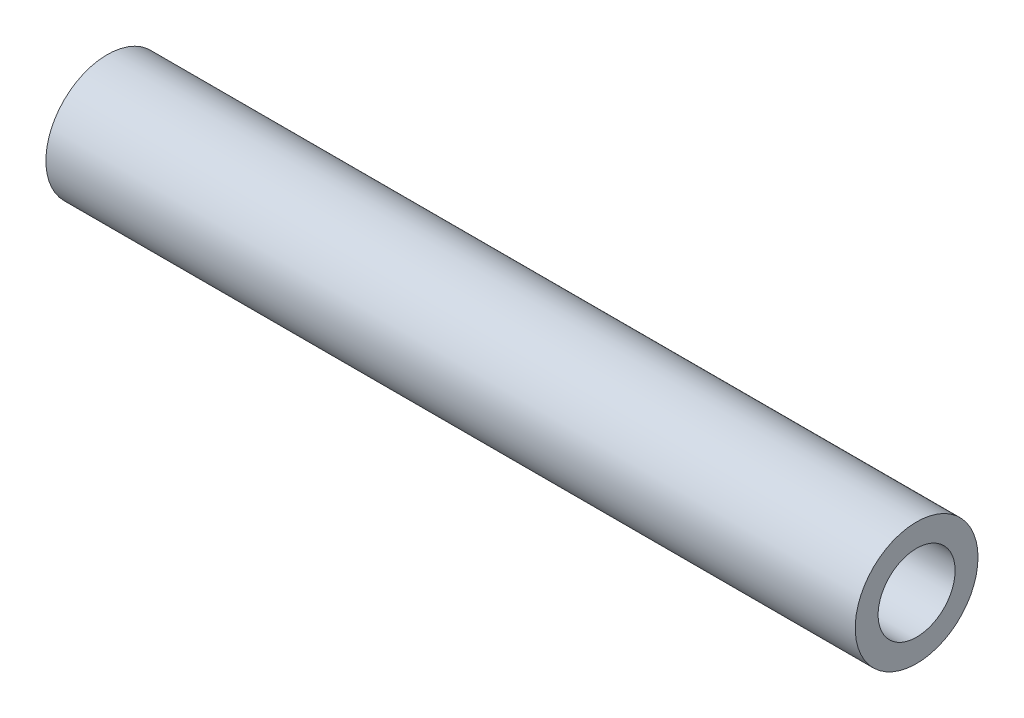
ISO-10303-21;
HEADER;
FILE_DESCRIPTION(('STEP AP214'),'2;1');
FILE_NAME('part.step','',(''),(''),'','','');
FILE_SCHEMA(('AUTOMOTIVE_DESIGN { 1 0 10303 214 1 1 1 1 }'));
ENDSEC;
DATA;
#1=APPLICATION_CONTEXT('core data for automotive mechanical design processes');
#2=APPLICATION_PROTOCOL_DEFINITION('international standard','automotive_design',2000,#1);
#3=PRODUCT_CONTEXT('',#1,'mechanical');
#4=PRODUCT('Part','Part','',(#3));
#5=PRODUCT_RELATED_PRODUCT_CATEGORY('part','',(#4));
#6=PRODUCT_DEFINITION_FORMATION('','',#4);
#7=PRODUCT_DEFINITION_CONTEXT('part definition',#1,'design');
#8=PRODUCT_DEFINITION('design','',#6,#7);
#9=PRODUCT_DEFINITION_SHAPE('','',#8);
#10=(LENGTH_UNIT() NAMED_UNIT(*) SI_UNIT(.MILLI.,.METRE.));
#11=(NAMED_UNIT(*) PLANE_ANGLE_UNIT() SI_UNIT($,.RADIAN.));
#12=(NAMED_UNIT(*) SI_UNIT($,.STERADIAN.) SOLID_ANGLE_UNIT());
#13=UNCERTAINTY_MEASURE_WITH_UNIT(LENGTH_MEASURE(1.E-05),#10,'distance_accuracy_value','');
#14=(GEOMETRIC_REPRESENTATION_CONTEXT(3) GLOBAL_UNCERTAINTY_ASSIGNED_CONTEXT((#13)) GLOBAL_UNIT_ASSIGNED_CONTEXT((#10,
#11,#12)) REPRESENTATION_CONTEXT('',''));
#15=CARTESIAN_POINT('',(0.,0.,0.));
#16=DIRECTION('',(0.,0.,1.));
#17=DIRECTION('',(1.,0.,0.));
#18=AXIS2_PLACEMENT_3D('',#15,#16,#17);
#19=CARTESIAN_POINT('',(52.324,0.,0.));
#20=DIRECTION('',(1.,0.,0.));
#21=DIRECTION('',(0.,0.,-1.));
#22=AXIS2_PLACEMENT_3D('',#19,#20,#21);
#23=PLANE('',#22);
#24=CARTESIAN_POINT('',(52.324,0.,0.));
#25=DIRECTION('',(1.,0.,0.));
#26=DIRECTION('',(0.,0.,-1.));
#27=AXIS2_PLACEMENT_3D('',#24,#25,#26);
#28=CIRCLE('',#27,3.96875);
#29=CARTESIAN_POINT('',(52.324,0.,-3.96875));
#30=VERTEX_POINT('',#29);
#31=EDGE_CURVE('E10',#30,#30,#28,.T.);
#32=ORIENTED_EDGE('',*,*,#31,.T.);
#33=EDGE_LOOP('',(#32));
#34=FACE_BOUND('',#33,.T.);
#35=CARTESIAN_POINT('',(52.324,0.,0.));
#36=DIRECTION('',(1.,0.,0.));
#37=DIRECTION('',(0.,0.,-1.));
#38=AXIS2_PLACEMENT_3D('',#35,#36,#37);
#39=CIRCLE('',#38,2.4892);
#40=CARTESIAN_POINT('',(52.324,0.,-2.4892));
#41=VERTEX_POINT('',#40);
#42=EDGE_CURVE('E42',#41,#41,#39,.T.);
#43=ORIENTED_EDGE('',*,*,#42,.F.);
#44=EDGE_LOOP('',(#43));
#45=FACE_BOUND('',#44,.T.);
#46=ADVANCED_FACE('F31',(#34,#45),#23,.T.);
#47=CARTESIAN_POINT('',(0.,0.,0.));
#48=DIRECTION('',(1.,0.,0.));
#49=DIRECTION('',(0.,0.,-1.));
#50=AXIS2_PLACEMENT_3D('',#47,#48,#49);
#51=PLANE('',#50);
#52=CARTESIAN_POINT('',(0.,0.,0.));
#53=DIRECTION('',(1.,0.,0.));
#54=DIRECTION('',(0.,0.,-1.));
#55=AXIS2_PLACEMENT_3D('',#52,#53,#54);
#56=CIRCLE('',#55,3.96875);
#57=CARTESIAN_POINT('',(0.,0.,-3.96875));
#58=VERTEX_POINT('',#57);
#59=EDGE_CURVE('E35',#58,#58,#56,.T.);
#60=ORIENTED_EDGE('',*,*,#59,.F.);
#61=EDGE_LOOP('',(#60));
#62=FACE_BOUND('',#61,.T.);
#63=CARTESIAN_POINT('',(0.,0.,0.));
#64=DIRECTION('',(1.,0.,0.));
#65=DIRECTION('',(0.,0.,-1.));
#66=AXIS2_PLACEMENT_3D('',#63,#64,#65);
#67=CIRCLE('',#66,2.4892);
#68=CARTESIAN_POINT('',(0.,0.,-2.4892));
#69=VERTEX_POINT('',#68);
#70=EDGE_CURVE('E44',#69,#69,#67,.T.);
#71=ORIENTED_EDGE('',*,*,#70,.T.);
#72=EDGE_LOOP('',(#71));
#73=FACE_BOUND('',#72,.T.);
#74=ADVANCED_FACE('F54',(#62,#73),#51,.F.);
#75=CARTESIAN_POINT('',(52.324,0.,0.));
#76=DIRECTION('',(-1.,0.,0.));
#77=DIRECTION('',(0.,0.,1.));
#78=AXIS2_PLACEMENT_3D('',#75,#76,#77);
#79=CYLINDRICAL_SURFACE('',#78,3.96875);
#80=ORIENTED_EDGE('',*,*,#31,.F.);
#81=EDGE_LOOP('',(#80));
#82=FACE_BOUND('',#81,.T.);
#83=ORIENTED_EDGE('',*,*,#59,.T.);
#84=EDGE_LOOP('',(#83));
#85=FACE_BOUND('',#84,.T.);
#86=ADVANCED_FACE('F33',(#82,#85),#79,.T.);
#87=CARTESIAN_POINT('',(52.324,0.,0.));
#88=DIRECTION('',(-1.,0.,0.));
#89=DIRECTION('',(0.,0.,1.));
#90=AXIS2_PLACEMENT_3D('',#87,#88,#89);
#91=CYLINDRICAL_SURFACE('',#90,2.4892);
#92=ORIENTED_EDGE('',*,*,#42,.T.);
#93=EDGE_LOOP('',(#92));
#94=FACE_BOUND('',#93,.T.);
#95=ORIENTED_EDGE('',*,*,#70,.F.);
#96=EDGE_LOOP('',(#95));
#97=FACE_BOUND('',#96,.T.);
#98=ADVANCED_FACE('F50',(#94,#97),#91,.F.);
#99=CLOSED_SHELL('',(#46,#74,#86,#98));
#100=MANIFOLD_SOLID_BREP('B2',#99);
#101=ADVANCED_BREP_SHAPE_REPRESENTATION('',(#18,#100),#14);
#102=SHAPE_DEFINITION_REPRESENTATION(#9,#101);
ENDSEC;
END-ISO-10303-21;
